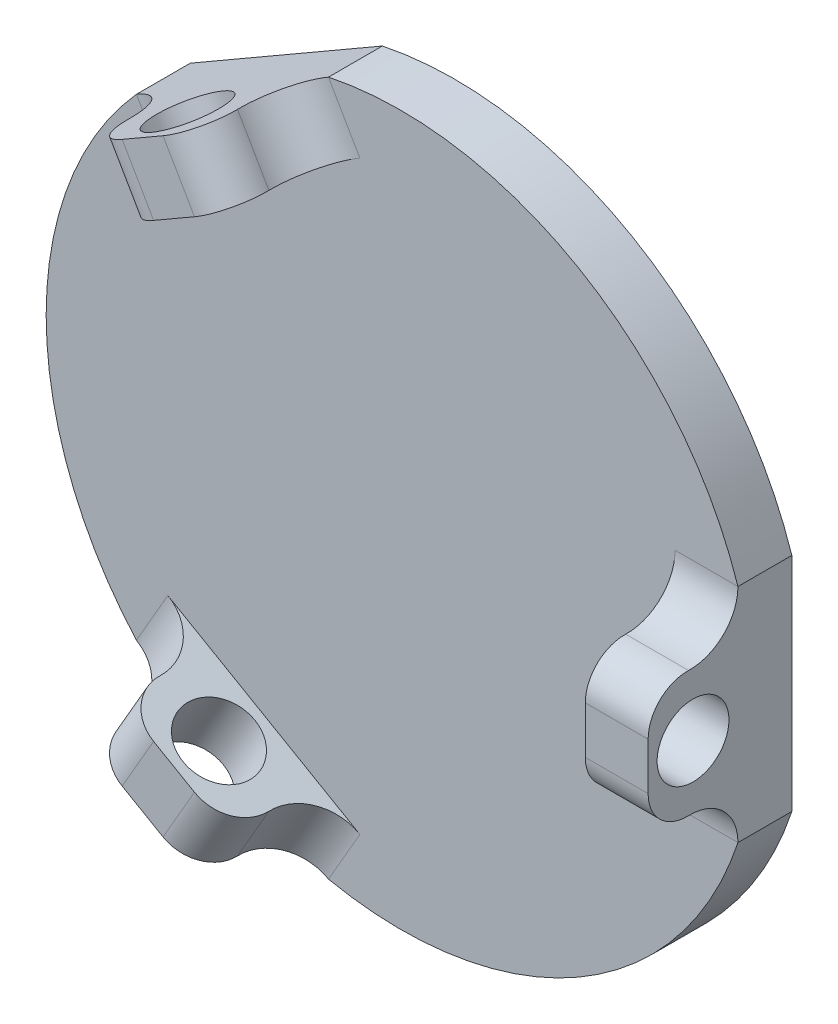
ISO-10303-21;
HEADER;
FILE_DESCRIPTION(('STEP AP214'),'2;1');
FILE_NAME('part.step','',(''),(''),'','','');
FILE_SCHEMA(('AUTOMOTIVE_DESIGN { 1 0 10303 214 1 1 1 1 }'));
ENDSEC;
DATA;
#1=APPLICATION_CONTEXT('core data for automotive mechanical design processes');
#2=APPLICATION_PROTOCOL_DEFINITION('international standard','automotive_design',2000,#1);
#3=PRODUCT_CONTEXT('',#1,'mechanical');
#4=PRODUCT('Part','Part','',(#3));
#5=PRODUCT_RELATED_PRODUCT_CATEGORY('part','',(#4));
#6=PRODUCT_DEFINITION_FORMATION('','',#4);
#7=PRODUCT_DEFINITION_CONTEXT('part definition',#1,'design');
#8=PRODUCT_DEFINITION('design','',#6,#7);
#9=PRODUCT_DEFINITION_SHAPE('','',#8);
#10=(LENGTH_UNIT() NAMED_UNIT(*) SI_UNIT(.MILLI.,.METRE.));
#11=(NAMED_UNIT(*) PLANE_ANGLE_UNIT() SI_UNIT($,.RADIAN.));
#12=(NAMED_UNIT(*) SI_UNIT($,.STERADIAN.) SOLID_ANGLE_UNIT());
#13=UNCERTAINTY_MEASURE_WITH_UNIT(LENGTH_MEASURE(1.E-05),#10,'distance_accuracy_value','');
#14=(GEOMETRIC_REPRESENTATION_CONTEXT(3) GLOBAL_UNCERTAINTY_ASSIGNED_CONTEXT((#13)) GLOBAL_UNIT_ASSIGNED_CONTEXT((#10,
#11,#12)) REPRESENTATION_CONTEXT('',''));
#15=CARTESIAN_POINT('',(0.,0.,0.));
#16=DIRECTION('',(0.,0.,1.));
#17=DIRECTION('',(1.,0.,0.));
#18=AXIS2_PLACEMENT_3D('',#15,#16,#17);
#19=CARTESIAN_POINT('',(0.,0.,8.54261656714267));
#20=DIRECTION('',(0.,0.,-1.));
#21=DIRECTION('',(-1.,0.,0.));
#22=AXIS2_PLACEMENT_3D('',#19,#20,#21);
#23=CYLINDRICAL_SURFACE('',#22,79.);
#24=CARTESIAN_POINT('',(0.,0.,8.54261656714267));
#25=DIRECTION('',(0.,0.,1.));
#26=DIRECTION('',(1.,0.,0.));
#27=AXIS2_PLACEMENT_3D('',#24,#25,#26);
#28=CIRCLE('',#27,79.);
#29=CARTESIAN_POINT('',(-16.1391435930308,-77.3338738463523,8.54261656714265));
#30=VERTEX_POINT('',#29);
#31=CARTESIAN_POINT('',(75.0426711205178,-24.6900285762859,8.54261656714267));
#32=VERTEX_POINT('',#31);
#33=EDGE_CURVE('E244',#30,#32,#28,.T.);
#34=ORIENTED_EDGE('',*,*,#33,.F.);
#35=DIRECTION('',(0.,0.,-1.));
#36=VECTOR('',#35,1.);
#37=CARTESIAN_POINT('',(-16.1391435930308,-77.3338738463523,8.54261656714267));
#38=LINE('',#37,#36);
#39=CARTESIAN_POINT('',(-16.1391435930309,-77.3338738463523,-3.45738343285733));
#40=VERTEX_POINT('',#39);
#41=EDGE_CURVE('E11',#30,#40,#38,.T.);
#42=ORIENTED_EDGE('',*,*,#41,.T.);
#43=CARTESIAN_POINT('',(0.,0.,-3.45738343285733));
#44=DIRECTION('',(0.,0.,1.));
#45=DIRECTION('',(1.,0.,0.));
#46=AXIS2_PLACEMENT_3D('',#43,#44,#45);
#47=CIRCLE('',#46,79.);
#48=CARTESIAN_POINT('',(75.0426711205178,-24.6900285762858,-3.45738343285733));
#49=VERTEX_POINT('',#48);
#50=EDGE_CURVE('E65',#40,#49,#47,.T.);
#51=ORIENTED_EDGE('',*,*,#50,.T.);
#52=DIRECTION('',(0.,0.,-1.));
#53=VECTOR('',#52,1.);
#54=CARTESIAN_POINT('',(75.0426711205177,-24.6900285762859,8.54261656714267));
#55=LINE('',#54,#53);
#56=EDGE_CURVE('E222',#49,#32,#55,.F.);
#57=ORIENTED_EDGE('',*,*,#56,.T.);
#58=EDGE_LOOP('',(#34,#42,#51,#57));
#59=FACE_BOUND('',#58,.T.);
#60=ADVANCED_FACE('F50',(#59),#23,.T.);
#61=CARTESIAN_POINT('',(-37.5213355602583,-64.9888595582096,-3.45740743285733));
#62=DIRECTION('',(0.499999999999992,0.866025403784443,0.));
#63=DIRECTION('',(0.,0.,1.));
#64=AXIS2_PLACEMENT_3D('',#61,#62,#63);
#65=PLANE('',#64);
#66=CARTESIAN_POINT('',(-37.5213355602583,-64.9888595582096,18.5426165671427));
#67=DIRECTION('',(-0.499999999999992,-0.866025403784443,0.));
#68=DIRECTION('',(0.,0.,-1.));
#69=AXIS2_PLACEMENT_3D('',#66,#67,#68);
#70=CIRCLE('',#69,8.);
#71=CARTESIAN_POINT('',(-37.5213355602583,-64.9888595582096,10.5426165671427));
#72=VERTEX_POINT('',#71);
#73=EDGE_CURVE('E355',#72,#72,#70,.T.);
#74=ORIENTED_EDGE('',*,*,#73,.F.);
#75=EDGE_LOOP('',(#74));
#76=FACE_BOUND('',#75,.T.);
#77=CARTESIAN_POINT('',(-16.1391435930308,-77.3338738463523,19.2370121012377));
#78=DIRECTION('',(0.499999999999992,0.866025403784443,0.));
#79=DIRECTION('',(0.,0.,-1.));
#80=AXIS2_PLACEMENT_3D('',#77,#78,#79);
#81=CIRCLE('',#80,10.694395534095);
#82=CARTESIAN_POINT('',(-25.3969795330373,-71.9888597742763,19.5426166118461));
#83=VERTEX_POINT('',#82);
#84=EDGE_CURVE('E331',#30,#83,#81,.T.);
#85=ORIENTED_EDGE('',*,*,#84,.T.);
#86=CARTESIAN_POINT('',(-32.9715725064546,-67.6156664820721,19.7926566637222));
#87=DIRECTION('',(-0.499999999999992,-0.866025403784443,0.));
#88=DIRECTION('',(0.,0.,1.));
#89=AXIS2_PLACEMENT_3D('',#86,#87,#88);
#90=CIRCLE('',#89,8.74995990342041);
#91=CARTESIAN_POINT('',(-32.9715725064546,-67.6156664820721,28.5426165671427));
#92=VERTEX_POINT('',#91);
#93=EDGE_CURVE('E322',#83,#92,#90,.T.);
#94=ORIENTED_EDGE('',*,*,#93,.T.);
#95=DIRECTION('',(0.866025403784443,-0.499999999999992,0.));
#96=VECTOR('',#95,1.);
#97=CARTESIAN_POINT('',(-16.1391435930308,-77.3338738463523,28.5426165671427));
#98=LINE('',#97,#96);
#99=CARTESIAN_POINT('',(-42.0710986140619,-62.3620526343471,28.5426165671427));
#100=VERTEX_POINT('',#99);
#101=EDGE_CURVE('E364',#100,#92,#98,.T.);
#102=ORIENTED_EDGE('',*,*,#101,.F.);
#103=CARTESIAN_POINT('',(-42.0710986140619,-62.3620526343471,19.7926566637223));
#104=DIRECTION('',(0.499999999999992,0.866025403784443,0.));
#105=DIRECTION('',(0.,0.,1.));
#106=AXIS2_PLACEMENT_3D('',#103,#104,#105);
#107=CIRCLE('',#106,8.74995990342041);
#108=CARTESIAN_POINT('',(-49.6456915874792,-57.9888593421428,19.5426166118462));
#109=VERTEX_POINT('',#108);
#110=EDGE_CURVE('E339',#109,#100,#107,.T.);
#111=ORIENTED_EDGE('',*,*,#110,.F.);
#112=CARTESIAN_POINT('',(-58.9035275274857,-52.6438452700668,19.2370121012377));
#113=DIRECTION('',(-0.499999999999992,-0.866025403784443,0.));
#114=DIRECTION('',(0.,0.,-1.));
#115=AXIS2_PLACEMENT_3D('',#112,#113,#114);
#116=CIRCLE('',#115,10.694395534095);
#117=CARTESIAN_POINT('',(-58.9035275274857,-52.6438452700668,8.54261656714267));
#118=VERTEX_POINT('',#117);
#119=EDGE_CURVE('E349',#118,#109,#116,.T.);
#120=ORIENTED_EDGE('',*,*,#119,.F.);
#121=DIRECTION('',(0.,0.,-1.));
#122=VECTOR('',#121,1.);
#123=CARTESIAN_POINT('',(-58.9035275274857,-52.6438452700668,8.54261656714267));
#124=LINE('',#123,#122);
#125=CARTESIAN_POINT('',(-58.9035275274857,-52.6438452700669,-3.45738343285733));
#126=VERTEX_POINT('',#125);
#127=EDGE_CURVE('E370',#126,#118,#124,.F.);
#128=ORIENTED_EDGE('',*,*,#127,.F.);
#129=DIRECTION('',(-0.866025403784443,0.499999999999992,0.));
#130=VECTOR('',#129,1.);
#131=CARTESIAN_POINT('',(-37.5213355602583,-64.9888595582096,-3.45738343285733));
#132=LINE('',#131,#130);
#133=EDGE_CURVE('E58',#40,#126,#132,.T.);
#134=ORIENTED_EDGE('',*,*,#133,.F.);
#135=ORIENTED_EDGE('',*,*,#41,.F.);
#136=EDGE_LOOP('',(#85,#94,#102,#111,#120,#128,#134,#135));
#137=FACE_BOUND('',#136,.T.);
#138=ADVANCED_FACE('F52',(#76,#137),#65,.F.);
#139=CARTESIAN_POINT('',(-9.13914359303093,-65.2095181933701,28.5426165671427));
#140=DIRECTION('',(-0.499999999999992,-0.866025403784443,0.));
#141=DIRECTION('',(0.,0.,-1.));
#142=AXIS2_PLACEMENT_3D('',#139,#140,#141);
#143=PLANE('',#142);
#144=CARTESIAN_POINT('',(-30.5213355602584,-52.8645039052273,18.5426165671427));
#145=DIRECTION('',(-0.499999999999992,-0.866025403784443,0.));
#146=DIRECTION('',(0.,0.,-1.));
#147=AXIS2_PLACEMENT_3D('',#144,#145,#146);
#148=CIRCLE('',#147,8.);
#149=CARTESIAN_POINT('',(-30.5213355602584,-52.8645039052273,10.5426165671427));
#150=VERTEX_POINT('',#149);
#151=EDGE_CURVE('E358',#150,#150,#148,.T.);
#152=ORIENTED_EDGE('',*,*,#151,.T.);
#153=EDGE_LOOP('',(#152));
#154=FACE_BOUND('',#153,.T.);
#155=CARTESIAN_POINT('',(-9.1391435930309,-65.2095181933701,19.2370121012377));
#156=DIRECTION('',(-0.499999999999992,-0.866025403784443,0.));
#157=DIRECTION('',(0.,0.,-1.));
#158=AXIS2_PLACEMENT_3D('',#155,#156,#157);
#159=CIRCLE('',#158,10.694395534095);
#160=CARTESIAN_POINT('',(-9.13914359303091,-65.2095181933701,8.54261656714265));
#161=VERTEX_POINT('',#160);
#162=CARTESIAN_POINT('',(-18.3969795330374,-59.864504121294,19.5426166118461));
#163=VERTEX_POINT('',#162);
#164=EDGE_CURVE('E328',#161,#163,#159,.F.);
#165=ORIENTED_EDGE('',*,*,#164,.F.);
#166=DIRECTION('',(-0.866025403784443,0.499999999999992,0.));
#167=VECTOR('',#166,1.);
#168=CARTESIAN_POINT('',(-9.13914359303093,-65.2095181933701,8.54261656714267));
#169=LINE('',#168,#167);
#170=CARTESIAN_POINT('',(-51.9035275274858,-40.5194896170846,8.54261656714267));
#171=VERTEX_POINT('',#170);
#172=EDGE_CURVE('E367',#161,#171,#169,.T.);
#173=ORIENTED_EDGE('',*,*,#172,.T.);
#174=CARTESIAN_POINT('',(-51.9035275274858,-40.5194896170846,19.2370121012377));
#175=DIRECTION('',(-0.499999999999992,-0.866025403784443,0.));
#176=DIRECTION('',(0.,0.,-1.));
#177=AXIS2_PLACEMENT_3D('',#174,#175,#176);
#178=CIRCLE('',#177,10.694395534095);
#179=CARTESIAN_POINT('',(-42.6456915874793,-45.8645036891606,19.5426166118462));
#180=VERTEX_POINT('',#179);
#181=EDGE_CURVE('E352',#171,#180,#178,.T.);
#182=ORIENTED_EDGE('',*,*,#181,.T.);
#183=CARTESIAN_POINT('',(-35.071098614062,-50.2376969813648,19.7926566637223));
#184=DIRECTION('',(-0.499999999999992,-0.866025403784443,0.));
#185=DIRECTION('',(0.,0.,-1.));
#186=AXIS2_PLACEMENT_3D('',#183,#184,#185);
#187=CIRCLE('',#186,8.74995990342041);
#188=CARTESIAN_POINT('',(-35.071098614062,-50.2376969813648,28.5426165671427));
#189=VERTEX_POINT('',#188);
#190=EDGE_CURVE('E343',#180,#189,#187,.F.);
#191=ORIENTED_EDGE('',*,*,#190,.T.);
#192=DIRECTION('',(-0.866025403784443,0.499999999999992,0.));
#193=VECTOR('',#192,1.);
#194=CARTESIAN_POINT('',(-9.13914359303093,-65.2095181933701,28.5426165671427));
#195=LINE('',#194,#193);
#196=CARTESIAN_POINT('',(-25.9715725064547,-55.4913108290898,28.5426165671427));
#197=VERTEX_POINT('',#196);
#198=EDGE_CURVE('E361',#197,#189,#195,.T.);
#199=ORIENTED_EDGE('',*,*,#198,.F.);
#200=CARTESIAN_POINT('',(-25.9715725064547,-55.4913108290898,19.7926566637222));
#201=DIRECTION('',(-0.499999999999992,-0.866025403784443,0.));
#202=DIRECTION('',(0.,0.,-1.));
#203=AXIS2_PLACEMENT_3D('',#200,#201,#202);
#204=CIRCLE('',#203,8.74995990342041);
#205=EDGE_CURVE('E318',#163,#197,#204,.T.);
#206=ORIENTED_EDGE('',*,*,#205,.F.);
#207=EDGE_LOOP('',(#165,#173,#182,#191,#199,#206));
#208=FACE_BOUND('',#207,.T.);
#209=ADVANCED_FACE('F389',(#154,#208),#143,.F.);
#210=CARTESIAN_POINT('',(0.,0.,28.5426165671427));
#211=DIRECTION('',(0.,0.,-1.));
#212=DIRECTION('',(0.499999999999992,0.866025403784443,0.));
#213=AXIS2_PLACEMENT_3D('',#210,#211,#212);
#214=PLANE('',#213);
#215=DIRECTION('',(-0.499999999999992,-0.866025403784443,0.));
#216=VECTOR('',#215,1.);
#217=CARTESIAN_POINT('',(44.049763053803,65.7891999751085,28.5426165671427));
#218=LINE('',#217,#216);
#219=EDGE_CURVE('E320',#197,#92,#218,.T.);
#220=ORIENTED_EDGE('',*,*,#219,.F.);
#221=ORIENTED_EDGE('',*,*,#198,.T.);
#222=DIRECTION('',(-0.499999999999992,-0.866025403784443,0.));
#223=VECTOR('',#222,1.);
#224=CARTESIAN_POINT('',(34.9502369461957,71.0428138228335,28.5426165671427));
#225=LINE('',#224,#223);
#226=EDGE_CURVE('E341',#100,#189,#225,.F.);
#227=ORIENTED_EDGE('',*,*,#226,.F.);
#228=ORIENTED_EDGE('',*,*,#101,.T.);
#229=EDGE_LOOP('',(#220,#221,#227,#228));
#230=FACE_BOUND('',#229,.T.);
#231=ADVANCED_FACE('F398',(#230),#214,.F.);
#232=CARTESIAN_POINT('',(39.4999999999994,68.416006898971,18.5426165671427));
#233=DIRECTION('',(-0.499999999999992,-0.866025403784443,0.));
#234=DIRECTION('',(0.,0.,-1.));
#235=AXIS2_PLACEMENT_3D('',#232,#233,#234);
#236=CYLINDRICAL_SURFACE('',#235,8.);
#237=ORIENTED_EDGE('',*,*,#73,.T.);
#238=EDGE_LOOP('',(#237));
#239=FACE_BOUND('',#238,.T.);
#240=ORIENTED_EDGE('',*,*,#151,.F.);
#241=EDGE_LOOP('',(#240));
#242=FACE_BOUND('',#241,.T.);
#243=ADVANCED_FACE('F405',(#239,#242),#236,.F.);
#244=CARTESIAN_POINT('',(18.1178080327719,80.7610211871138,19.2370121012377));
#245=DIRECTION('',(-0.499999999999992,-0.866025403784443,0.));
#246=DIRECTION('',(0.,0.,-1.));
#247=AXIS2_PLACEMENT_3D('',#244,#245,#246);
#248=CYLINDRICAL_SURFACE('',#247,10.694395534095);
#249=DIRECTION('',(-0.499999999999992,-0.866025403784443,0.));
#250=VECTOR('',#249,1.);
#251=CARTESIAN_POINT('',(-58.9035275274857,-52.6438452700668,8.54261656714267));
#252=LINE('',#251,#250);
#253=EDGE_CURVE('E346',#171,#118,#252,.T.);
#254=ORIENTED_EDGE('',*,*,#253,.T.);
#255=ORIENTED_EDGE('',*,*,#119,.T.);
#256=DIRECTION('',(-0.499999999999992,-0.866025403784443,0.));
#257=VECTOR('',#256,1.);
#258=CARTESIAN_POINT('',(27.3756439727784,75.4160071150377,19.5426166118462));
#259=LINE('',#258,#257);
#260=EDGE_CURVE('E337',#180,#109,#259,.T.);
#261=ORIENTED_EDGE('',*,*,#260,.F.);
#262=ORIENTED_EDGE('',*,*,#181,.F.);
#263=EDGE_LOOP('',(#254,#255,#261,#262));
#264=FACE_BOUND('',#263,.T.);
#265=ADVANCED_FACE('F403',(#264),#248,.F.);
#266=CARTESIAN_POINT('',(34.9502369461957,71.0428138228335,19.7926566637223));
#267=DIRECTION('',(-0.499999999999992,-0.866025403784443,0.));
#268=DIRECTION('',(0.,0.,-1.));
#269=AXIS2_PLACEMENT_3D('',#266,#267,#268);
#270=CYLINDRICAL_SURFACE('',#269,8.74995990342041);
#271=ORIENTED_EDGE('',*,*,#260,.T.);
#272=ORIENTED_EDGE('',*,*,#110,.T.);
#273=ORIENTED_EDGE('',*,*,#226,.T.);
#274=ORIENTED_EDGE('',*,*,#190,.F.);
#275=EDGE_LOOP('',(#271,#272,#273,#274));
#276=FACE_BOUND('',#275,.T.);
#277=ADVANCED_FACE('F401',(#276),#270,.T.);
#278=CARTESIAN_POINT('',(60.8821919672268,56.0709926108283,19.2370121012377));
#279=DIRECTION('',(-0.499999999999992,-0.866025403784443,0.));
#280=DIRECTION('',(0.,0.,-1.));
#281=AXIS2_PLACEMENT_3D('',#278,#279,#280);
#282=CYLINDRICAL_SURFACE('',#281,10.694395534095);
#283=ORIENTED_EDGE('',*,*,#164,.T.);
#284=DIRECTION('',(-0.499999999999992,-0.866025403784443,0.));
#285=VECTOR('',#284,1.);
#286=CARTESIAN_POINT('',(51.6243560272203,61.4160066829043,19.5426166118461));
#287=LINE('',#286,#285);
#288=EDGE_CURVE('E325',#163,#83,#287,.T.);
#289=ORIENTED_EDGE('',*,*,#288,.T.);
#290=ORIENTED_EDGE('',*,*,#84,.F.);
#291=DIRECTION('',(0.499999999999991,0.866025403784443,0.));
#292=VECTOR('',#291,1.);
#293=CARTESIAN_POINT('',(-16.1391435930308,-77.3338738463523,8.54261656714267));
#294=LINE('',#293,#292);
#295=EDGE_CURVE('E334',#30,#161,#294,.T.);
#296=ORIENTED_EDGE('',*,*,#295,.T.);
#297=EDGE_LOOP('',(#283,#289,#290,#296));
#298=FACE_BOUND('',#297,.T.);
#299=ADVANCED_FACE('F383',(#298),#282,.F.);
#300=CARTESIAN_POINT('',(44.049763053803,65.7891999751085,19.7926566637222));
#301=DIRECTION('',(-0.499999999999992,-0.866025403784443,0.));
#302=DIRECTION('',(0.,0.,-1.));
#303=AXIS2_PLACEMENT_3D('',#300,#301,#302);
#304=CYLINDRICAL_SURFACE('',#303,8.74995990342041);
#305=ORIENTED_EDGE('',*,*,#205,.T.);
#306=ORIENTED_EDGE('',*,*,#219,.T.);
#307=ORIENTED_EDGE('',*,*,#93,.F.);
#308=ORIENTED_EDGE('',*,*,#288,.F.);
#309=EDGE_LOOP('',(#305,#306,#307,#308));
#310=FACE_BOUND('',#309,.T.);
#311=ADVANCED_FACE('F393',(#310),#304,.T.);
#312=CARTESIAN_POINT('',(-58.9035275274865,52.643845270066,8.54261656714265));
#313=VERTEX_POINT('',#312);
#314=EDGE_CURVE('E245',#313,#118,#28,.T.);
#315=ORIENTED_EDGE('',*,*,#314,.F.);
#316=DIRECTION('',(0.,0.,-1.));
#317=VECTOR('',#316,1.);
#318=CARTESIAN_POINT('',(-58.9035275274865,52.643845270066,8.54261656714267));
#319=LINE('',#318,#317);
#320=CARTESIAN_POINT('',(-58.9035275274864,52.6438452700661,-3.45738343285733));
#321=VERTEX_POINT('',#320);
#322=EDGE_CURVE('E316',#313,#321,#319,.T.);
#323=ORIENTED_EDGE('',*,*,#322,.T.);
#324=EDGE_CURVE('E73',#321,#126,#47,.T.);
#325=ORIENTED_EDGE('',*,*,#324,.T.);
#326=ORIENTED_EDGE('',*,*,#127,.T.);
#327=EDGE_LOOP('',(#315,#323,#325,#326));
#328=FACE_BOUND('',#327,.T.);
#329=ADVANCED_FACE('F416',(#328),#23,.T.);
#330=CARTESIAN_POINT('',(-37.5213355602592,64.9888595582091,-3.45740743285733));
#331=DIRECTION('',(0.500000000000004,-0.866025403784436,0.));
#332=DIRECTION('',(0.,0.,1.));
#333=AXIS2_PLACEMENT_3D('',#330,#331,#332);
#334=PLANE('',#333);
#335=CARTESIAN_POINT('',(-37.5213355602592,64.9888595582091,18.5426165671427));
#336=DIRECTION('',(-0.500000000000004,0.866025403784436,0.));
#337=DIRECTION('',(0.,0.,-1.));
#338=AXIS2_PLACEMENT_3D('',#335,#336,#337);
#339=CIRCLE('',#338,8.);
#340=CARTESIAN_POINT('',(-37.5213355602592,64.9888595582091,10.5426165671427));
#341=VERTEX_POINT('',#340);
#342=EDGE_CURVE('E295',#341,#341,#339,.T.);
#343=ORIENTED_EDGE('',*,*,#342,.F.);
#344=EDGE_LOOP('',(#343));
#345=FACE_BOUND('',#344,.T.);
#346=CARTESIAN_POINT('',(-58.9035275274865,52.643845270066,19.2370121012377));
#347=DIRECTION('',(0.500000000000004,-0.866025403784436,0.));
#348=DIRECTION('',(0.,0.,-1.));
#349=AXIS2_PLACEMENT_3D('',#346,#347,#348);
#350=CIRCLE('',#349,10.694395534095);
#351=CARTESIAN_POINT('',(-49.6456915874801,57.9888593421422,19.5426166118461));
#352=VERTEX_POINT('',#351);
#353=EDGE_CURVE('E271',#313,#352,#350,.T.);
#354=ORIENTED_EDGE('',*,*,#353,.T.);
#355=CARTESIAN_POINT('',(-42.0710986140628,62.3620526343465,19.7926566637222));
#356=DIRECTION('',(-0.500000000000004,0.866025403784436,0.));
#357=DIRECTION('',(0.,0.,1.));
#358=AXIS2_PLACEMENT_3D('',#355,#356,#357);
#359=CIRCLE('',#358,8.74995990342041);
#360=CARTESIAN_POINT('',(-42.0710986140628,62.3620526343465,28.5426165671427));
#361=VERTEX_POINT('',#360);
#362=EDGE_CURVE('E262',#352,#361,#359,.T.);
#363=ORIENTED_EDGE('',*,*,#362,.T.);
#364=DIRECTION('',(-0.866025403784436,-0.500000000000004,0.));
#365=VECTOR('',#364,1.);
#366=CARTESIAN_POINT('',(-58.9035275274865,52.643845270066,28.5426165671427));
#367=LINE('',#366,#365);
#368=CARTESIAN_POINT('',(-32.9715725064556,67.6156664820716,28.5426165671427));
#369=VERTEX_POINT('',#368);
#370=EDGE_CURVE('E304',#369,#361,#367,.T.);
#371=ORIENTED_EDGE('',*,*,#370,.F.);
#372=CARTESIAN_POINT('',(-32.9715725064556,67.6156664820716,19.7926566637223));
#373=DIRECTION('',(0.500000000000004,-0.866025403784436,0.));
#374=DIRECTION('',(0.,0.,1.));
#375=AXIS2_PLACEMENT_3D('',#372,#373,#374);
#376=CIRCLE('',#375,8.74995990342041);
#377=CARTESIAN_POINT('',(-25.3969795330383,71.988859774276,19.5426166118462));
#378=VERTEX_POINT('',#377);
#379=EDGE_CURVE('E279',#378,#369,#376,.T.);
#380=ORIENTED_EDGE('',*,*,#379,.F.);
#381=CARTESIAN_POINT('',(-16.1391435930319,77.3338738463521,19.2370121012377));
#382=DIRECTION('',(-0.500000000000004,0.866025403784436,0.));
#383=DIRECTION('',(0.,0.,-1.));
#384=AXIS2_PLACEMENT_3D('',#381,#382,#383);
#385=CIRCLE('',#384,10.694395534095);
#386=CARTESIAN_POINT('',(-16.1391435930319,77.3338738463521,8.54261656714267));
#387=VERTEX_POINT('',#386);
#388=EDGE_CURVE('E289',#387,#378,#385,.T.);
#389=ORIENTED_EDGE('',*,*,#388,.F.);
#390=DIRECTION('',(0.,0.,-1.));
#391=VECTOR('',#390,1.);
#392=CARTESIAN_POINT('',(-16.1391435930319,77.3338738463521,8.54261656714267));
#393=LINE('',#392,#391);
#394=CARTESIAN_POINT('',(-16.139143593032,77.3338738463521,-3.45738343285733));
#395=VERTEX_POINT('',#394);
#396=EDGE_CURVE('E310',#395,#387,#393,.F.);
#397=ORIENTED_EDGE('',*,*,#396,.F.);
#398=DIRECTION('',(0.866025403784436,0.500000000000004,0.));
#399=VECTOR('',#398,1.);
#400=CARTESIAN_POINT('',(-37.5213355602592,64.9888595582091,-3.45738343285733));
#401=LINE('',#400,#399);
#402=EDGE_CURVE('E313',#321,#395,#401,.T.);
#403=ORIENTED_EDGE('',*,*,#402,.F.);
#404=ORIENTED_EDGE('',*,*,#322,.F.);
#405=EDGE_LOOP('',(#354,#363,#371,#380,#389,#397,#403,#404));
#406=FACE_BOUND('',#405,.T.);
#407=ADVANCED_FACE('F425',(#345,#406),#334,.F.);
#408=CARTESIAN_POINT('',(-51.9035275274864,40.5194896170839,28.5426165671427));
#409=DIRECTION('',(-0.500000000000004,0.866025403784436,0.));
#410=DIRECTION('',(0.,0.,-1.));
#411=AXIS2_PLACEMENT_3D('',#408,#409,#410);
#412=PLANE('',#411);
#413=CARTESIAN_POINT('',(-30.5213355602591,52.8645039052269,18.5426165671427));
#414=DIRECTION('',(-0.500000000000004,0.866025403784436,0.));
#415=DIRECTION('',(0.,0.,-1.));
#416=AXIS2_PLACEMENT_3D('',#413,#414,#415);
#417=CIRCLE('',#416,8.);
#418=CARTESIAN_POINT('',(-30.5213355602591,52.8645039052269,10.5426165671427));
#419=VERTEX_POINT('',#418);
#420=EDGE_CURVE('E298',#419,#419,#417,.T.);
#421=ORIENTED_EDGE('',*,*,#420,.T.);
#422=EDGE_LOOP('',(#421));
#423=FACE_BOUND('',#422,.T.);
#424=CARTESIAN_POINT('',(-51.9035275274864,40.5194896170839,19.2370121012377));
#425=DIRECTION('',(-0.500000000000004,0.866025403784436,0.));
#426=DIRECTION('',(0.,0.,-1.));
#427=AXIS2_PLACEMENT_3D('',#424,#425,#426);
#428=CIRCLE('',#427,10.694395534095);
#429=CARTESIAN_POINT('',(-51.9035275274864,40.5194896170839,8.54261656714265));
#430=VERTEX_POINT('',#429);
#431=CARTESIAN_POINT('',(-42.64569158748,45.86450368916,19.5426166118461));
#432=VERTEX_POINT('',#431);
#433=EDGE_CURVE('E268',#430,#432,#428,.F.);
#434=ORIENTED_EDGE('',*,*,#433,.F.);
#435=DIRECTION('',(0.866025403784436,0.500000000000004,0.));
#436=VECTOR('',#435,1.);
#437=CARTESIAN_POINT('',(-51.9035275274864,40.5194896170839,8.54261656714267));
#438=LINE('',#437,#436);
#439=CARTESIAN_POINT('',(-9.13914359303183,65.20951819337,8.54261656714267));
#440=VERTEX_POINT('',#439);
#441=EDGE_CURVE('E307',#430,#440,#438,.T.);
#442=ORIENTED_EDGE('',*,*,#441,.T.);
#443=CARTESIAN_POINT('',(-9.13914359303183,65.20951819337,19.2370121012377));
#444=DIRECTION('',(-0.500000000000004,0.866025403784436,0.));
#445=DIRECTION('',(0.,0.,-1.));
#446=AXIS2_PLACEMENT_3D('',#443,#444,#445);
#447=CIRCLE('',#446,10.694395534095);
#448=CARTESIAN_POINT('',(-18.3969795330383,59.8645041212938,19.5426166118462));
#449=VERTEX_POINT('',#448);
#450=EDGE_CURVE('E292',#440,#449,#447,.T.);
#451=ORIENTED_EDGE('',*,*,#450,.T.);
#452=CARTESIAN_POINT('',(-25.9715725064555,55.4913108290895,19.7926566637223));
#453=DIRECTION('',(-0.500000000000004,0.866025403784436,0.));
#454=DIRECTION('',(0.,0.,-1.));
#455=AXIS2_PLACEMENT_3D('',#452,#453,#454);
#456=CIRCLE('',#455,8.74995990342041);
#457=CARTESIAN_POINT('',(-25.9715725064555,55.4913108290895,28.5426165671427));
#458=VERTEX_POINT('',#457);
#459=EDGE_CURVE('E283',#449,#458,#456,.F.);
#460=ORIENTED_EDGE('',*,*,#459,.T.);
#461=DIRECTION('',(0.866025403784436,0.500000000000004,0.));
#462=VECTOR('',#461,1.);
#463=CARTESIAN_POINT('',(-51.9035275274864,40.5194896170839,28.5426165671427));
#464=LINE('',#463,#462);
#465=CARTESIAN_POINT('',(-35.0710986140627,50.2376969813644,28.5426165671427));
#466=VERTEX_POINT('',#465);
#467=EDGE_CURVE('E301',#466,#458,#464,.T.);
#468=ORIENTED_EDGE('',*,*,#467,.F.);
#469=CARTESIAN_POINT('',(-35.0710986140627,50.2376969813644,19.7926566637222));
#470=DIRECTION('',(-0.500000000000004,0.866025403784436,0.));
#471=DIRECTION('',(0.,0.,-1.));
#472=AXIS2_PLACEMENT_3D('',#469,#470,#471);
#473=CIRCLE('',#472,8.74995990342041);
#474=EDGE_CURVE('E258',#432,#466,#473,.T.);
#475=ORIENTED_EDGE('',*,*,#474,.F.);
#476=EDGE_LOOP('',(#434,#442,#451,#460,#468,#475));
#477=FACE_BOUND('',#476,.T.);
#478=ADVANCED_FACE('F458',(#423,#477),#412,.F.);
#479=CARTESIAN_POINT('',(0.,0.,28.5426165671427));
#480=DIRECTION('',(0.,0.,-1.));
#481=DIRECTION('',(0.500000000000004,-0.866025403784436,0.));
#482=AXIS2_PLACEMENT_3D('',#479,#480,#481);
#483=PLANE('',#482);
#484=DIRECTION('',(-0.500000000000004,0.866025403784436,0.));
#485=VECTOR('',#484,1.);
#486=CARTESIAN_POINT('',(34.9502369461967,-71.0428138228331,28.5426165671427));
#487=LINE('',#486,#485);
#488=EDGE_CURVE('E260',#466,#361,#487,.T.);
#489=ORIENTED_EDGE('',*,*,#488,.F.);
#490=ORIENTED_EDGE('',*,*,#467,.T.);
#491=DIRECTION('',(-0.500000000000004,0.866025403784436,0.));
#492=VECTOR('',#491,1.);
#493=CARTESIAN_POINT('',(44.0497630538039,-65.7891999751079,28.5426165671427));
#494=LINE('',#493,#492);
#495=EDGE_CURVE('E281',#369,#458,#494,.F.);
#496=ORIENTED_EDGE('',*,*,#495,.F.);
#497=ORIENTED_EDGE('',*,*,#370,.T.);
#498=EDGE_LOOP('',(#489,#490,#496,#497));
#499=FACE_BOUND('',#498,.T.);
#500=ADVANCED_FACE('F455',(#499),#483,.F.);
#501=CARTESIAN_POINT('',(39.5000000000003,-68.4160068989705,18.5426165671427));
#502=DIRECTION('',(-0.500000000000004,0.866025403784436,0.));
#503=DIRECTION('',(0.,0.,-1.));
#504=AXIS2_PLACEMENT_3D('',#501,#502,#503);
#505=CYLINDRICAL_SURFACE('',#504,8.);
#506=ORIENTED_EDGE('',*,*,#342,.T.);
#507=EDGE_LOOP('',(#506));
#508=FACE_BOUND('',#507,.T.);
#509=ORIENTED_EDGE('',*,*,#420,.F.);
#510=EDGE_LOOP('',(#509));
#511=FACE_BOUND('',#510,.T.);
#512=ADVANCED_FACE('F479',(#508,#511),#505,.F.);
#513=CARTESIAN_POINT('',(60.8821919672276,-56.0709926108274,19.2370121012377));
#514=DIRECTION('',(-0.500000000000004,0.866025403784436,0.));
#515=DIRECTION('',(0.,0.,-1.));
#516=AXIS2_PLACEMENT_3D('',#513,#514,#515);
#517=CYLINDRICAL_SURFACE('',#516,10.694395534095);
#518=DIRECTION('',(-0.500000000000004,0.866025403784436,0.));
#519=VECTOR('',#518,1.);
#520=CARTESIAN_POINT('',(-16.1391435930319,77.3338738463521,8.54261656714267));
#521=LINE('',#520,#519);
#522=EDGE_CURVE('E286',#440,#387,#521,.T.);
#523=ORIENTED_EDGE('',*,*,#522,.T.);
#524=ORIENTED_EDGE('',*,*,#388,.T.);
#525=DIRECTION('',(-0.500000000000004,0.866025403784436,0.));
#526=VECTOR('',#525,1.);
#527=CARTESIAN_POINT('',(51.6243560272212,-61.4160066829036,19.5426166118462));
#528=LINE('',#527,#526);
#529=EDGE_CURVE('E277',#449,#378,#528,.T.);
#530=ORIENTED_EDGE('',*,*,#529,.F.);
#531=ORIENTED_EDGE('',*,*,#450,.F.);
#532=EDGE_LOOP('',(#523,#524,#530,#531));
#533=FACE_BOUND('',#532,.T.);
#534=ADVANCED_FACE('F445',(#533),#517,.F.);
#535=CARTESIAN_POINT('',(44.0497630538039,-65.7891999751079,19.7926566637223));
#536=DIRECTION('',(-0.500000000000004,0.866025403784436,0.));
#537=DIRECTION('',(0.,0.,-1.));
#538=AXIS2_PLACEMENT_3D('',#535,#536,#537);
#539=CYLINDRICAL_SURFACE('',#538,8.74995990342041);
#540=ORIENTED_EDGE('',*,*,#529,.T.);
#541=ORIENTED_EDGE('',*,*,#379,.T.);
#542=ORIENTED_EDGE('',*,*,#495,.T.);
#543=ORIENTED_EDGE('',*,*,#459,.F.);
#544=EDGE_LOOP('',(#540,#541,#542,#543));
#545=FACE_BOUND('',#544,.T.);
#546=ADVANCED_FACE('F451',(#545),#539,.T.);
#547=CARTESIAN_POINT('',(18.117808032773,-80.7610211871136,19.2370121012377));
#548=DIRECTION('',(-0.500000000000004,0.866025403784436,0.));
#549=DIRECTION('',(0.,0.,-1.));
#550=AXIS2_PLACEMENT_3D('',#547,#548,#549);
#551=CYLINDRICAL_SURFACE('',#550,10.694395534095);
#552=ORIENTED_EDGE('',*,*,#433,.T.);
#553=DIRECTION('',(-0.500000000000004,0.866025403784436,0.));
#554=VECTOR('',#553,1.);
#555=CARTESIAN_POINT('',(27.3756439727795,-75.4160071150374,19.5426166118461));
#556=LINE('',#555,#554);
#557=EDGE_CURVE('E265',#432,#352,#556,.T.);
#558=ORIENTED_EDGE('',*,*,#557,.T.);
#559=ORIENTED_EDGE('',*,*,#353,.F.);
#560=DIRECTION('',(0.500000000000005,-0.866025403784436,0.));
#561=VECTOR('',#560,1.);
#562=CARTESIAN_POINT('',(-58.9035275274865,52.643845270066,8.54261656714267));
#563=LINE('',#562,#561);
#564=EDGE_CURVE('E274',#313,#430,#563,.T.);
#565=ORIENTED_EDGE('',*,*,#564,.T.);
#566=EDGE_LOOP('',(#552,#558,#559,#565));
#567=FACE_BOUND('',#566,.T.);
#568=ADVANCED_FACE('F464',(#567),#551,.F.);
#569=CARTESIAN_POINT('',(34.9502369461967,-71.0428138228331,19.7926566637222));
#570=DIRECTION('',(-0.500000000000004,0.866025403784436,0.));
#571=DIRECTION('',(0.,0.,-1.));
#572=AXIS2_PLACEMENT_3D('',#569,#570,#571);
#573=CYLINDRICAL_SURFACE('',#572,8.74995990342041);
#574=ORIENTED_EDGE('',*,*,#474,.T.);
#575=ORIENTED_EDGE('',*,*,#488,.T.);
#576=ORIENTED_EDGE('',*,*,#362,.F.);
#577=ORIENTED_EDGE('',*,*,#557,.F.);
#578=EDGE_LOOP('',(#574,#575,#576,#577));
#579=FACE_BOUND('',#578,.T.);
#580=ADVANCED_FACE('F466',(#579),#573,.T.);
#581=CARTESIAN_POINT('',(0.,0.,28.5426165671427));
#582=DIRECTION('',(0.,0.,-1.));
#583=DIRECTION('',(-1.,0.,0.));
#584=AXIS2_PLACEMENT_3D('',#581,#582,#583);
#585=PLANE('',#584);
#586=DIRECTION('',(1.,0.,0.));
#587=VECTOR('',#586,1.);
#588=CARTESIAN_POINT('',(-79.,5.2536138477251,28.5426165671427));
#589=LINE('',#588,#587);
#590=CARTESIAN_POINT('',(61.0426711205177,5.2536138477251,28.5426165671427));
#591=VERTEX_POINT('',#590);
#592=CARTESIAN_POINT('',(75.0426711205178,5.2536138477251,28.5426165671427));
#593=VERTEX_POINT('',#592);
#594=EDGE_CURVE('E195',#591,#593,#589,.T.);
#595=ORIENTED_EDGE('',*,*,#594,.F.);
#596=DIRECTION('',(0.,-1.,0.));
#597=VECTOR('',#596,1.);
#598=CARTESIAN_POINT('',(61.0426711205177,24.6900285762859,28.5426165671427));
#599=LINE('',#598,#597);
#600=CARTESIAN_POINT('',(61.0426711205177,-5.25361384772507,28.5426165671427));
#601=VERTEX_POINT('',#600);
#602=EDGE_CURVE('E219',#591,#601,#599,.T.);
#603=ORIENTED_EDGE('',*,*,#602,.T.);
#604=DIRECTION('',(1.,0.,0.));
#605=VECTOR('',#604,1.);
#606=CARTESIAN_POINT('',(-79.,-5.25361384772507,28.5426165671427));
#607=LINE('',#606,#605);
#608=CARTESIAN_POINT('',(75.0426711205177,-5.25361384772506,28.5426165671427));
#609=VERTEX_POINT('',#608);
#610=EDGE_CURVE('E218',#609,#601,#607,.F.);
#611=ORIENTED_EDGE('',*,*,#610,.F.);
#612=DIRECTION('',(0.,1.,0.));
#613=VECTOR('',#612,1.);
#614=CARTESIAN_POINT('',(75.0426711205177,24.6900285762859,28.5426165671427));
#615=LINE('',#614,#613);
#616=EDGE_CURVE('E212',#609,#593,#615,.T.);
#617=ORIENTED_EDGE('',*,*,#616,.T.);
#618=EDGE_LOOP('',(#595,#603,#611,#617));
#619=FACE_BOUND('',#618,.T.);
#620=ADVANCED_FACE('F216',(#619),#585,.F.);
#621=CARTESIAN_POINT('',(75.0426711205178,0.,-3.45740743285733));
#622=DIRECTION('',(-1.,0.,0.));
#623=DIRECTION('',(0.,0.,1.));
#624=AXIS2_PLACEMENT_3D('',#621,#622,#623);
#625=PLANE('',#624);
#626=CARTESIAN_POINT('',(75.0426711205178,0.,18.5426165671427));
#627=DIRECTION('',(1.,0.,0.));
#628=DIRECTION('',(0.,0.,-1.));
#629=AXIS2_PLACEMENT_3D('',#626,#627,#628);
#630=CIRCLE('',#629,8.);
#631=CARTESIAN_POINT('',(75.0426711205178,0.,10.5426165671427));
#632=VERTEX_POINT('',#631);
#633=EDGE_CURVE('E253',#632,#632,#630,.T.);
#634=ORIENTED_EDGE('',*,*,#633,.F.);
#635=EDGE_LOOP('',(#634));
#636=FACE_BOUND('',#635,.T.);
#637=CARTESIAN_POINT('',(75.0426711205178,24.6900285762859,19.2370121012377));
#638=DIRECTION('',(-1.,0.,0.));
#639=DIRECTION('',(0.,0.,-1.));
#640=AXIS2_PLACEMENT_3D('',#637,#638,#639);
#641=CIRCLE('',#640,10.694395534095);
#642=CARTESIAN_POINT('',(75.0426711205178,24.6900285762859,8.54261656714265));
#643=VERTEX_POINT('',#642);
#644=CARTESIAN_POINT('',(75.0426711205178,14.0000004321337,19.5426166118461));
#645=VERTEX_POINT('',#644);
#646=EDGE_CURVE('E206',#643,#645,#641,.T.);
#647=ORIENTED_EDGE('',*,*,#646,.T.);
#648=CARTESIAN_POINT('',(75.0426711205178,5.2536138477251,19.7926566637222));
#649=DIRECTION('',(1.,0.,0.));
#650=DIRECTION('',(0.,0.,1.));
#651=AXIS2_PLACEMENT_3D('',#648,#649,#650);
#652=CIRCLE('',#651,8.74995990342041);
#653=EDGE_CURVE('E198',#645,#593,#652,.T.);
#654=ORIENTED_EDGE('',*,*,#653,.T.);
#655=ORIENTED_EDGE('',*,*,#616,.F.);
#656=CARTESIAN_POINT('',(75.0426711205178,-5.25361384772507,19.7926566637223));
#657=DIRECTION('',(-1.,0.,0.));
#658=DIRECTION('',(0.,0.,1.));
#659=AXIS2_PLACEMENT_3D('',#656,#657,#658);
#660=CIRCLE('',#659,8.74995990342041);
#661=CARTESIAN_POINT('',(75.0426711205178,-14.0000004321337,19.5426166118462));
#662=VERTEX_POINT('',#661);
#663=EDGE_CURVE('E643',#662,#609,#660,.T.);
#664=ORIENTED_EDGE('',*,*,#663,.F.);
#665=CARTESIAN_POINT('',(75.0426711205178,-24.6900285762859,19.2370121012377));
#666=DIRECTION('',(1.,0.,0.));
#667=DIRECTION('',(0.,0.,-1.));
#668=AXIS2_PLACEMENT_3D('',#665,#666,#667);
#669=CIRCLE('',#668,10.694395534095);
#670=EDGE_CURVE('E252',#32,#662,#669,.T.);
#671=ORIENTED_EDGE('',*,*,#670,.F.);
#672=ORIENTED_EDGE('',*,*,#56,.F.);
#673=DIRECTION('',(0.,-1.,0.));
#674=VECTOR('',#673,1.);
#675=CARTESIAN_POINT('',(75.0426711205178,0.,-3.45738343285733));
#676=LINE('',#675,#674);
#677=CARTESIAN_POINT('',(75.0426711205178,24.6900285762858,-3.45738343285733));
#678=VERTEX_POINT('',#677);
#679=EDGE_CURVE('E243',#678,#49,#676,.T.);
#680=ORIENTED_EDGE('',*,*,#679,.F.);
#681=DIRECTION('',(0.,0.,-1.));
#682=VECTOR('',#681,1.);
#683=CARTESIAN_POINT('',(75.0426711205177,24.6900285762859,8.54261656714267));
#684=LINE('',#683,#682);
#685=EDGE_CURVE('E237',#643,#678,#684,.T.);
#686=ORIENTED_EDGE('',*,*,#685,.F.);
#687=EDGE_LOOP('',(#647,#654,#655,#664,#671,#672,#680,#686));
#688=FACE_BOUND('',#687,.T.);
#689=ADVANCED_FACE('F210',(#636,#688),#625,.F.);
#690=CARTESIAN_POINT('',(61.0426711205177,24.6900285762859,28.5426165671427));
#691=DIRECTION('',(1.,0.,0.));
#692=DIRECTION('',(0.,0.,-1.));
#693=AXIS2_PLACEMENT_3D('',#690,#691,#692);
#694=PLANE('',#693);
#695=CARTESIAN_POINT('',(61.0426711205177,0.,18.5426165671427));
#696=DIRECTION('',(1.,0.,0.));
#697=DIRECTION('',(0.,0.,-1.));
#698=AXIS2_PLACEMENT_3D('',#695,#696,#697);
#699=CIRCLE('',#698,8.);
#700=CARTESIAN_POINT('',(61.0426711205177,0.,10.5426165671427));
#701=VERTEX_POINT('',#700);
#702=EDGE_CURVE('E249',#701,#701,#699,.T.);
#703=ORIENTED_EDGE('',*,*,#702,.T.);
#704=EDGE_LOOP('',(#703));
#705=FACE_BOUND('',#704,.T.);
#706=CARTESIAN_POINT('',(61.0426711205177,24.6900285762859,19.2370121012377));
#707=DIRECTION('',(1.,0.,0.));
#708=DIRECTION('',(0.,0.,-1.));
#709=AXIS2_PLACEMENT_3D('',#706,#707,#708);
#710=CIRCLE('',#709,10.694395534095);
#711=CARTESIAN_POINT('',(61.0426711205177,24.6900285762859,8.54261656714265));
#712=VERTEX_POINT('',#711);
#713=CARTESIAN_POINT('',(61.0426711205177,14.0000004321337,19.5426166118461));
#714=VERTEX_POINT('',#713);
#715=EDGE_CURVE('E255',#712,#714,#710,.F.);
#716=ORIENTED_EDGE('',*,*,#715,.F.);
#717=DIRECTION('',(0.,-1.,0.));
#718=VECTOR('',#717,1.);
#719=CARTESIAN_POINT('',(61.0426711205177,24.6900285762859,8.54261656714267));
#720=LINE('',#719,#718);
#721=CARTESIAN_POINT('',(61.0426711205177,-24.6900285762859,8.54261656714267));
#722=VERTEX_POINT('',#721);
#723=EDGE_CURVE('E225',#712,#722,#720,.T.);
#724=ORIENTED_EDGE('',*,*,#723,.T.);
#725=CARTESIAN_POINT('',(61.0426711205177,-24.6900285762859,19.2370121012377));
#726=DIRECTION('',(1.,0.,0.));
#727=DIRECTION('',(0.,0.,-1.));
#728=AXIS2_PLACEMENT_3D('',#725,#726,#727);
#729=CIRCLE('',#728,10.694395534095);
#730=CARTESIAN_POINT('',(61.0426711205177,-14.0000004321337,19.5426166118462));
#731=VERTEX_POINT('',#730);
#732=EDGE_CURVE('E228',#722,#731,#729,.T.);
#733=ORIENTED_EDGE('',*,*,#732,.T.);
#734=CARTESIAN_POINT('',(61.0426711205177,-5.25361384772507,19.7926566637223));
#735=DIRECTION('',(1.,0.,0.));
#736=DIRECTION('',(0.,0.,-1.));
#737=AXIS2_PLACEMENT_3D('',#734,#735,#736);
#738=CIRCLE('',#737,8.74995990342041);
#739=EDGE_CURVE('E649',#731,#601,#738,.F.);
#740=ORIENTED_EDGE('',*,*,#739,.T.);
#741=ORIENTED_EDGE('',*,*,#602,.F.);
#742=CARTESIAN_POINT('',(61.0426711205177,5.2536138477251,19.7926566637222));
#743=DIRECTION('',(1.,0.,0.));
#744=DIRECTION('',(0.,0.,-1.));
#745=AXIS2_PLACEMENT_3D('',#742,#743,#744);
#746=CIRCLE('',#745,8.74995990342041);
#747=EDGE_CURVE('E201',#714,#591,#746,.T.);
#748=ORIENTED_EDGE('',*,*,#747,.F.);
#749=EDGE_LOOP('',(#716,#724,#733,#740,#741,#748));
#750=FACE_BOUND('',#749,.T.);
#751=ADVANCED_FACE('F427',(#705,#750),#694,.F.);
#752=EDGE_CURVE('E241',#643,#387,#28,.T.);
#753=ORIENTED_EDGE('',*,*,#752,.F.);
#754=ORIENTED_EDGE('',*,*,#685,.T.);
#755=EDGE_CURVE('E240',#678,#395,#47,.T.);
#756=ORIENTED_EDGE('',*,*,#755,.T.);
#757=ORIENTED_EDGE('',*,*,#396,.T.);
#758=EDGE_LOOP('',(#753,#754,#756,#757));
#759=FACE_BOUND('',#758,.T.);
#760=ADVANCED_FACE('F417',(#759),#23,.T.);
#761=CARTESIAN_POINT('',(0.,0.,8.54261656714267));
#762=DIRECTION('',(0.,0.,1.));
#763=DIRECTION('',(1.,0.,0.));
#764=AXIS2_PLACEMENT_3D('',#761,#762,#763);
#765=PLANE('',#764);
#766=ORIENTED_EDGE('',*,*,#314,.T.);
#767=ORIENTED_EDGE('',*,*,#253,.F.);
#768=ORIENTED_EDGE('',*,*,#172,.F.);
#769=ORIENTED_EDGE('',*,*,#295,.F.);
#770=ORIENTED_EDGE('',*,*,#33,.T.);
#771=DIRECTION('',(1.,0.,0.));
#772=VECTOR('',#771,1.);
#773=CARTESIAN_POINT('',(75.0426711205177,-24.6900285762859,8.54261656714267));
#774=LINE('',#773,#772);
#775=EDGE_CURVE('E220',#722,#32,#774,.T.);
#776=ORIENTED_EDGE('',*,*,#775,.F.);
#777=ORIENTED_EDGE('',*,*,#723,.F.);
#778=DIRECTION('',(-1.,0.,0.));
#779=VECTOR('',#778,1.);
#780=CARTESIAN_POINT('',(75.0426711205177,24.6900285762859,8.54261656714267));
#781=LINE('',#780,#779);
#782=EDGE_CURVE('E231',#643,#712,#781,.T.);
#783=ORIENTED_EDGE('',*,*,#782,.F.);
#784=ORIENTED_EDGE('',*,*,#752,.T.);
#785=ORIENTED_EDGE('',*,*,#522,.F.);
#786=ORIENTED_EDGE('',*,*,#441,.F.);
#787=ORIENTED_EDGE('',*,*,#564,.F.);
#788=EDGE_LOOP('',(#766,#767,#768,#769,#770,#776,#777,#783,#784,#785,#786,#787));
#789=FACE_BOUND('',#788,.T.);
#790=ADVANCED_FACE('F386',(#789),#765,.T.);
#791=CARTESIAN_POINT('',(0.,0.,-3.45738343285733));
#792=DIRECTION('',(0.,0.,1.));
#793=DIRECTION('',(1.,0.,0.));
#794=AXIS2_PLACEMENT_3D('',#791,#792,#793);
#795=PLANE('',#794);
#796=ORIENTED_EDGE('',*,*,#324,.F.);
#797=ORIENTED_EDGE('',*,*,#402,.T.);
#798=ORIENTED_EDGE('',*,*,#755,.F.);
#799=ORIENTED_EDGE('',*,*,#679,.T.);
#800=ORIENTED_EDGE('',*,*,#50,.F.);
#801=ORIENTED_EDGE('',*,*,#133,.T.);
#802=EDGE_LOOP('',(#796,#797,#798,#799,#800,#801));
#803=FACE_BOUND('',#802,.T.);
#804=ADVANCED_FACE('F371',(#803),#795,.F.);
#805=CARTESIAN_POINT('',(-79.,-24.6900285762859,19.2370121012377));
#806=DIRECTION('',(1.,0.,0.));
#807=DIRECTION('',(0.,0.,-1.));
#808=AXIS2_PLACEMENT_3D('',#805,#806,#807);
#809=CYLINDRICAL_SURFACE('',#808,10.694395534095);
#810=ORIENTED_EDGE('',*,*,#775,.T.);
#811=ORIENTED_EDGE('',*,*,#670,.T.);
#812=DIRECTION('',(1.,0.,0.));
#813=VECTOR('',#812,1.);
#814=CARTESIAN_POINT('',(-79.,-14.0000004321337,19.5426166118462));
#815=LINE('',#814,#813);
#816=EDGE_CURVE('E645',#731,#662,#815,.T.);
#817=ORIENTED_EDGE('',*,*,#816,.F.);
#818=ORIENTED_EDGE('',*,*,#732,.F.);
#819=EDGE_LOOP('',(#810,#811,#817,#818));
#820=FACE_BOUND('',#819,.T.);
#821=ADVANCED_FACE('F605',(#820),#809,.F.);
#822=CARTESIAN_POINT('',(-79.,-5.25361384772507,19.7926566637223));
#823=DIRECTION('',(1.,0.,0.));
#824=DIRECTION('',(0.,0.,-1.));
#825=AXIS2_PLACEMENT_3D('',#822,#823,#824);
#826=CYLINDRICAL_SURFACE('',#825,8.74995990342041);
#827=ORIENTED_EDGE('',*,*,#816,.T.);
#828=ORIENTED_EDGE('',*,*,#663,.T.);
#829=ORIENTED_EDGE('',*,*,#610,.T.);
#830=ORIENTED_EDGE('',*,*,#739,.F.);
#831=EDGE_LOOP('',(#827,#828,#829,#830));
#832=FACE_BOUND('',#831,.T.);
#833=ADVANCED_FACE('F596',(#832),#826,.T.);
#834=CARTESIAN_POINT('',(-79.,0.,18.5426165671427));
#835=DIRECTION('',(1.,0.,0.));
#836=DIRECTION('',(0.,0.,-1.));
#837=AXIS2_PLACEMENT_3D('',#834,#835,#836);
#838=CYLINDRICAL_SURFACE('',#837,8.);
#839=ORIENTED_EDGE('',*,*,#633,.T.);
#840=EDGE_LOOP('',(#839));
#841=FACE_BOUND('',#840,.T.);
#842=ORIENTED_EDGE('',*,*,#702,.F.);
#843=EDGE_LOOP('',(#842));
#844=FACE_BOUND('',#843,.T.);
#845=ADVANCED_FACE('F565',(#841,#844),#838,.F.);
#846=CARTESIAN_POINT('',(-79.,24.6900285762859,19.2370121012377));
#847=DIRECTION('',(1.,0.,0.));
#848=DIRECTION('',(0.,0.,-1.));
#849=AXIS2_PLACEMENT_3D('',#846,#847,#848);
#850=CYLINDRICAL_SURFACE('',#849,10.694395534095);
#851=ORIENTED_EDGE('',*,*,#715,.T.);
#852=DIRECTION('',(1.,0.,0.));
#853=VECTOR('',#852,1.);
#854=CARTESIAN_POINT('',(-79.,14.0000004321337,19.5426166118461));
#855=LINE('',#854,#853);
#856=EDGE_CURVE('E205',#714,#645,#855,.T.);
#857=ORIENTED_EDGE('',*,*,#856,.T.);
#858=ORIENTED_EDGE('',*,*,#646,.F.);
#859=ORIENTED_EDGE('',*,*,#782,.T.);
#860=EDGE_LOOP('',(#851,#857,#858,#859));
#861=FACE_BOUND('',#860,.T.);
#862=ADVANCED_FACE('F557',(#861),#850,.F.);
#863=CARTESIAN_POINT('',(-79.,5.2536138477251,19.7926566637222));
#864=DIRECTION('',(1.,0.,0.));
#865=DIRECTION('',(0.,0.,-1.));
#866=AXIS2_PLACEMENT_3D('',#863,#864,#865);
#867=CYLINDRICAL_SURFACE('',#866,8.74995990342041);
#868=ORIENTED_EDGE('',*,*,#747,.T.);
#869=ORIENTED_EDGE('',*,*,#594,.T.);
#870=ORIENTED_EDGE('',*,*,#653,.F.);
#871=ORIENTED_EDGE('',*,*,#856,.F.);
#872=EDGE_LOOP('',(#868,#869,#870,#871));
#873=FACE_BOUND('',#872,.T.);
#874=ADVANCED_FACE('F197',(#873),#867,.T.);
#875=CLOSED_SHELL('',(#60,#138,#209,#231,#243,#265,#277,#299,#311,#329,#407,#478,#500,#512,#534,
#546,#568,#580,#620,#689,#751,#760,#790,#804,#821,#833,#845,#862,#874));
#876=MANIFOLD_SOLID_BREP('B2',#875);
#877=ADVANCED_BREP_SHAPE_REPRESENTATION('',(#18,#876),#14);
#878=SHAPE_DEFINITION_REPRESENTATION(#9,#877);
ENDSEC;
END-ISO-10303-21;
